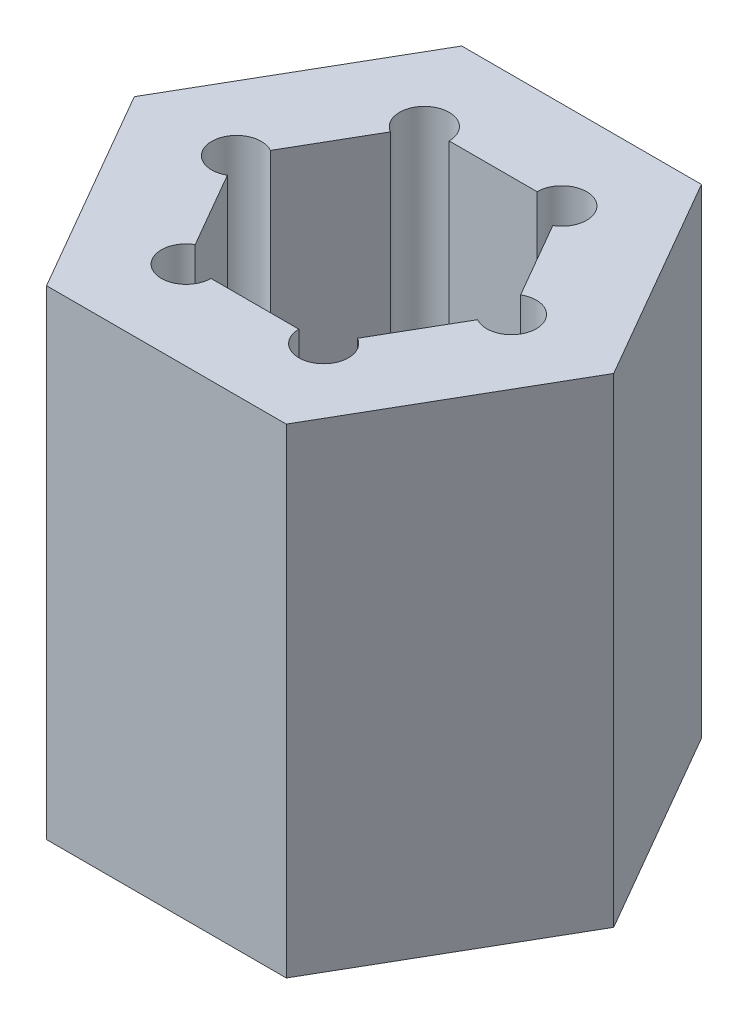
ISO-10303-21;
HEADER;
FILE_DESCRIPTION(('STEP AP214'),'2;1');
FILE_NAME('part.step','',(''),(''),'','','');
FILE_SCHEMA(('AUTOMOTIVE_DESIGN { 1 0 10303 214 1 1 1 1 }'));
ENDSEC;
DATA;
#1=APPLICATION_CONTEXT('core data for automotive mechanical design processes');
#2=APPLICATION_PROTOCOL_DEFINITION('international standard','automotive_design',2000,#1);
#3=PRODUCT_CONTEXT('',#1,'mechanical');
#4=PRODUCT('Part','Part','',(#3));
#5=PRODUCT_RELATED_PRODUCT_CATEGORY('part','',(#4));
#6=PRODUCT_DEFINITION_FORMATION('','',#4);
#7=PRODUCT_DEFINITION_CONTEXT('part definition',#1,'design');
#8=PRODUCT_DEFINITION('design','',#6,#7);
#9=PRODUCT_DEFINITION_SHAPE('','',#8);
#10=(LENGTH_UNIT() NAMED_UNIT(*) SI_UNIT(.MILLI.,.METRE.));
#11=(NAMED_UNIT(*) PLANE_ANGLE_UNIT() SI_UNIT($,.RADIAN.));
#12=(NAMED_UNIT(*) SI_UNIT($,.STERADIAN.) SOLID_ANGLE_UNIT());
#13=UNCERTAINTY_MEASURE_WITH_UNIT(LENGTH_MEASURE(1.E-05),#10,'distance_accuracy_value','');
#14=(GEOMETRIC_REPRESENTATION_CONTEXT(3) GLOBAL_UNCERTAINTY_ASSIGNED_CONTEXT((#13)) GLOBAL_UNIT_ASSIGNED_CONTEXT((#10,
#11,#12)) REPRESENTATION_CONTEXT('',''));
#15=CARTESIAN_POINT('',(0.,0.,0.));
#16=DIRECTION('',(0.,0.,1.));
#17=DIRECTION('',(1.,0.,0.));
#18=AXIS2_PLACEMENT_3D('',#15,#16,#17);
#19=CARTESIAN_POINT('',(0.,14.5,0.));
#20=DIRECTION('',(0.,1.,0.));
#21=DIRECTION('',(0.,0.,1.));
#22=AXIS2_PLACEMENT_3D('',#19,#20,#21);
#23=PLANE('',#22);
#24=CARTESIAN_POINT('',(-4.15692193816526,14.5,0.));
#25=DIRECTION('',(0.,1.,0.));
#26=DIRECTION('',(0.,0.,1.));
#27=AXIS2_PLACEMENT_3D('',#24,#25,#26);
#28=CIRCLE('',#27,0.75);
#29=CARTESIAN_POINT('',(-3.78192193816526,14.5,-0.649519052838404));
#30=VERTEX_POINT('',#29);
#31=CARTESIAN_POINT('',(-3.78192193816533,14.5,0.649519052838291));
#32=VERTEX_POINT('',#31);
#33=EDGE_CURVE('E357',#30,#32,#28,.T.);
#34=ORIENTED_EDGE('',*,*,#33,.F.);
#35=DIRECTION('',(-0.5,0.,0.866025403784439));
#36=VECTOR('',#35,1.);
#37=CARTESIAN_POINT('',(-2.07846096908265,14.5,-3.6));
#38=LINE('',#37,#36);
#39=CARTESIAN_POINT('',(-2.45346096908265,14.5,-2.95048094716167));
#40=VERTEX_POINT('',#39);
#41=EDGE_CURVE('E218',#40,#30,#38,.T.);
#42=ORIENTED_EDGE('',*,*,#41,.F.);
#43=CARTESIAN_POINT('',(-2.07846096908265,14.5,-3.6));
#44=DIRECTION('',(0.,1.,0.));
#45=DIRECTION('',(0.,0.,1.));
#46=AXIS2_PLACEMENT_3D('',#43,#44,#45);
#47=CIRCLE('',#46,0.75);
#48=CARTESIAN_POINT('',(-1.32846096908265,14.5,-3.6));
#49=VERTEX_POINT('',#48);
#50=EDGE_CURVE('E348',#49,#40,#47,.T.);
#51=ORIENTED_EDGE('',*,*,#50,.F.);
#52=DIRECTION('',(-1.,0.,0.));
#53=VECTOR('',#52,1.);
#54=CARTESIAN_POINT('',(2.07846096908265,14.5,-3.6));
#55=LINE('',#54,#53);
#56=CARTESIAN_POINT('',(1.32846096908266,14.5,-3.6));
#57=VERTEX_POINT('',#56);
#58=EDGE_CURVE('E206',#57,#49,#55,.T.);
#59=ORIENTED_EDGE('',*,*,#58,.F.);
#60=CARTESIAN_POINT('',(2.07846096908266,14.5,-3.6));
#61=DIRECTION('',(0.,1.,0.));
#62=DIRECTION('',(0.,0.,1.));
#63=AXIS2_PLACEMENT_3D('',#60,#61,#62);
#64=CIRCLE('',#63,0.75);
#65=CARTESIAN_POINT('',(2.45346096908266,14.5,-2.95048094716166));
#66=VERTEX_POINT('',#65);
#67=EDGE_CURVE('E68',#66,#57,#64,.T.);
#68=ORIENTED_EDGE('',*,*,#67,.F.);
#69=DIRECTION('',(-0.5,0.,-0.866025403784438));
#70=VECTOR('',#69,1.);
#71=CARTESIAN_POINT('',(4.1569219381653,14.5,0.));
#72=LINE('',#71,#70);
#73=CARTESIAN_POINT('',(3.78192193816531,14.5,-0.649519052838314));
#74=VERTEX_POINT('',#73);
#75=EDGE_CURVE('E200',#74,#66,#72,.T.);
#76=ORIENTED_EDGE('',*,*,#75,.F.);
#77=CARTESIAN_POINT('',(4.15692193816531,14.5,0.));
#78=DIRECTION('',(0.,1.,0.));
#79=DIRECTION('',(0.,0.,1.));
#80=AXIS2_PLACEMENT_3D('',#77,#78,#79);
#81=CIRCLE('',#80,0.749999999999999);
#82=CARTESIAN_POINT('',(3.7819219381653,14.5,0.649519052838341));
#83=VERTEX_POINT('',#82);
#84=EDGE_CURVE('E60',#83,#74,#81,.T.);
#85=ORIENTED_EDGE('',*,*,#84,.F.);
#86=DIRECTION('',(0.499999999999999,0.,-0.866025403784439));
#87=VECTOR('',#86,1.);
#88=CARTESIAN_POINT('',(2.07846096908265,14.5,3.6));
#89=LINE('',#88,#87);
#90=CARTESIAN_POINT('',(2.45346096908269,14.5,2.9504809471616));
#91=VERTEX_POINT('',#90);
#92=EDGE_CURVE('E189',#91,#83,#89,.T.);
#93=ORIENTED_EDGE('',*,*,#92,.F.);
#94=CARTESIAN_POINT('',(2.07846096908266,14.5,3.59999999999991));
#95=DIRECTION('',(0.,1.,0.));
#96=DIRECTION('',(0.,0.,1.));
#97=AXIS2_PLACEMENT_3D('',#94,#95,#96);
#98=CIRCLE('',#97,0.75);
#99=CARTESIAN_POINT('',(1.32846096908266,14.5,3.6));
#100=VERTEX_POINT('',#99);
#101=EDGE_CURVE('E169',#100,#91,#98,.T.);
#102=ORIENTED_EDGE('',*,*,#101,.F.);
#103=DIRECTION('',(1.,0.,0.));
#104=VECTOR('',#103,1.);
#105=CARTESIAN_POINT('',(-2.07846096908265,14.5,3.6));
#106=LINE('',#105,#104);
#107=CARTESIAN_POINT('',(-1.32846096908269,14.5,3.6));
#108=VERTEX_POINT('',#107);
#109=EDGE_CURVE('E226',#108,#100,#106,.T.);
#110=ORIENTED_EDGE('',*,*,#109,.F.);
#111=CARTESIAN_POINT('',(-2.07846096908269,14.5,3.59999999999998));
#112=DIRECTION('',(0.,1.,0.));
#113=DIRECTION('',(0.,0.,1.));
#114=AXIS2_PLACEMENT_3D('',#111,#112,#113);
#115=CIRCLE('',#114,0.75);
#116=CARTESIAN_POINT('',(-2.45346096908267,14.5,2.95048094716164));
#117=VERTEX_POINT('',#116);
#118=EDGE_CURVE('E364',#117,#108,#115,.T.);
#119=ORIENTED_EDGE('',*,*,#118,.F.);
#120=DIRECTION('',(0.5,0.,0.866025403784438));
#121=VECTOR('',#120,1.);
#122=CARTESIAN_POINT('',(-4.1569219381653,14.5,0.));
#123=LINE('',#122,#121);
#124=EDGE_CURVE('E222',#32,#117,#123,.T.);
#125=ORIENTED_EDGE('',*,*,#124,.F.);
#126=EDGE_LOOP('',(#34,#42,#51,#59,#68,#76,#85,#93,#102,#110,#119,#125));
#127=FACE_BOUND('',#126,.T.);
#128=DIRECTION('',(-1.,0.,0.));
#129=VECTOR('',#128,1.);
#130=CARTESIAN_POINT('',(3.6228729391649,14.5,-6.275));
#131=LINE('',#130,#129);
#132=CARTESIAN_POINT('',(3.6228729391649,14.5,-6.275));
#133=VERTEX_POINT('',#132);
#134=CARTESIAN_POINT('',(-3.6228729391649,14.5,-6.275));
#135=VERTEX_POINT('',#134);
#136=EDGE_CURVE('E247',#133,#135,#131,.T.);
#137=ORIENTED_EDGE('',*,*,#136,.T.);
#138=DIRECTION('',(-0.5,0.,0.866025403784439));
#139=VECTOR('',#138,1.);
#140=CARTESIAN_POINT('',(-3.6228729391649,14.5,-6.275));
#141=LINE('',#140,#139);
#142=CARTESIAN_POINT('',(-7.2457458783298,14.5,0.));
#143=VERTEX_POINT('',#142);
#144=EDGE_CURVE('E251',#135,#143,#141,.T.);
#145=ORIENTED_EDGE('',*,*,#144,.T.);
#146=DIRECTION('',(0.5,0.,0.866025403784438));
#147=VECTOR('',#146,1.);
#148=CARTESIAN_POINT('',(-7.2457458783298,14.5,0.));
#149=LINE('',#148,#147);
#150=CARTESIAN_POINT('',(-3.6228729391649,14.5,6.275));
#151=VERTEX_POINT('',#150);
#152=EDGE_CURVE('E255',#143,#151,#149,.T.);
#153=ORIENTED_EDGE('',*,*,#152,.T.);
#154=DIRECTION('',(1.,0.,0.));
#155=VECTOR('',#154,1.);
#156=CARTESIAN_POINT('',(-3.6228729391649,14.5,6.275));
#157=LINE('',#156,#155);
#158=CARTESIAN_POINT('',(3.6228729391649,14.5,6.275));
#159=VERTEX_POINT('',#158);
#160=EDGE_CURVE('E258',#151,#159,#157,.T.);
#161=ORIENTED_EDGE('',*,*,#160,.T.);
#162=DIRECTION('',(0.5,0.,-0.866025403784439));
#163=VECTOR('',#162,1.);
#164=CARTESIAN_POINT('',(3.6228729391649,14.5,6.275));
#165=LINE('',#164,#163);
#166=CARTESIAN_POINT('',(7.24574587832981,14.5,0.));
#167=VERTEX_POINT('',#166);
#168=EDGE_CURVE('E261',#159,#167,#165,.T.);
#169=ORIENTED_EDGE('',*,*,#168,.T.);
#170=DIRECTION('',(-0.5,0.,-0.866025403784438));
#171=VECTOR('',#170,1.);
#172=CARTESIAN_POINT('',(7.24574587832981,14.5,0.));
#173=LINE('',#172,#171);
#174=EDGE_CURVE('E264',#167,#133,#173,.T.);
#175=ORIENTED_EDGE('',*,*,#174,.T.);
#176=EDGE_LOOP('',(#137,#145,#153,#161,#169,#175));
#177=FACE_BOUND('',#176,.T.);
#178=ADVANCED_FACE('F45',(#127,#177),#23,.T.);
#179=CARTESIAN_POINT('',(0.,0.,0.));
#180=DIRECTION('',(0.,1.,0.));
#181=DIRECTION('',(0.,0.,1.));
#182=AXIS2_PLACEMENT_3D('',#179,#180,#181);
#183=PLANE('',#182);
#184=DIRECTION('',(-1.,0.,0.));
#185=VECTOR('',#184,1.);
#186=CARTESIAN_POINT('',(3.6228729391649,0.,-6.275));
#187=LINE('',#186,#185);
#188=CARTESIAN_POINT('',(3.6228729391649,0.,-6.275));
#189=VERTEX_POINT('',#188);
#190=CARTESIAN_POINT('',(-3.6228729391649,0.,-6.275));
#191=VERTEX_POINT('',#190);
#192=EDGE_CURVE('E229',#189,#191,#187,.T.);
#193=ORIENTED_EDGE('',*,*,#192,.F.);
#194=DIRECTION('',(-0.5,0.,-0.866025403784438));
#195=VECTOR('',#194,1.);
#196=CARTESIAN_POINT('',(7.24574587832981,0.,0.));
#197=LINE('',#196,#195);
#198=CARTESIAN_POINT('',(7.24574587832981,0.,0.));
#199=VERTEX_POINT('',#198);
#200=EDGE_CURVE('E252',#199,#189,#197,.T.);
#201=ORIENTED_EDGE('',*,*,#200,.F.);
#202=DIRECTION('',(0.5,0.,-0.866025403784439));
#203=VECTOR('',#202,1.);
#204=CARTESIAN_POINT('',(3.6228729391649,0.,6.275));
#205=LINE('',#204,#203);
#206=CARTESIAN_POINT('',(3.6228729391649,0.,6.275));
#207=VERTEX_POINT('',#206);
#208=EDGE_CURVE('E280',#207,#199,#205,.T.);
#209=ORIENTED_EDGE('',*,*,#208,.F.);
#210=DIRECTION('',(1.,0.,0.));
#211=VECTOR('',#210,1.);
#212=CARTESIAN_POINT('',(-3.6228729391649,0.,6.275));
#213=LINE('',#212,#211);
#214=CARTESIAN_POINT('',(-3.6228729391649,0.,6.275));
#215=VERTEX_POINT('',#214);
#216=EDGE_CURVE('E277',#215,#207,#213,.T.);
#217=ORIENTED_EDGE('',*,*,#216,.F.);
#218=DIRECTION('',(0.5,0.,0.866025403784438));
#219=VECTOR('',#218,1.);
#220=CARTESIAN_POINT('',(-7.2457458783298,0.,0.));
#221=LINE('',#220,#219);
#222=CARTESIAN_POINT('',(-7.2457458783298,0.,0.));
#223=VERTEX_POINT('',#222);
#224=EDGE_CURVE('E274',#223,#215,#221,.T.);
#225=ORIENTED_EDGE('',*,*,#224,.F.);
#226=DIRECTION('',(-0.5,0.,0.866025403784439));
#227=VECTOR('',#226,1.);
#228=CARTESIAN_POINT('',(-3.6228729391649,0.,-6.275));
#229=LINE('',#228,#227);
#230=EDGE_CURVE('E271',#191,#223,#229,.T.);
#231=ORIENTED_EDGE('',*,*,#230,.F.);
#232=EDGE_LOOP('',(#193,#201,#209,#217,#225,#231));
#233=FACE_BOUND('',#232,.T.);
#234=DIRECTION('',(-0.5,0.,0.866025403784439));
#235=VECTOR('',#234,1.);
#236=CARTESIAN_POINT('',(-2.07846096908265,0.,-3.6));
#237=LINE('',#236,#235);
#238=CARTESIAN_POINT('',(-2.45346096908265,0.,-2.95048094716167));
#239=VERTEX_POINT('',#238);
#240=CARTESIAN_POINT('',(-3.78192193816526,0.,-0.649519052838404));
#241=VERTEX_POINT('',#240);
#242=EDGE_CURVE('E240',#239,#241,#237,.T.);
#243=ORIENTED_EDGE('',*,*,#242,.T.);
#244=CARTESIAN_POINT('',(-4.15692193816526,0.,0.));
#245=DIRECTION('',(0.,1.,0.));
#246=DIRECTION('',(0.,0.,1.));
#247=AXIS2_PLACEMENT_3D('',#244,#245,#246);
#248=CIRCLE('',#247,0.75);
#249=CARTESIAN_POINT('',(-3.78192193816533,0.,0.649519052838291));
#250=VERTEX_POINT('',#249);
#251=EDGE_CURVE('E353',#241,#250,#248,.T.);
#252=ORIENTED_EDGE('',*,*,#251,.T.);
#253=DIRECTION('',(0.5,0.,0.866025403784438));
#254=VECTOR('',#253,1.);
#255=CARTESIAN_POINT('',(-4.1569219381653,0.,0.));
#256=LINE('',#255,#254);
#257=CARTESIAN_POINT('',(-2.45346096908267,0.,2.95048094716164));
#258=VERTEX_POINT('',#257);
#259=EDGE_CURVE('E209',#250,#258,#256,.T.);
#260=ORIENTED_EDGE('',*,*,#259,.T.);
#261=CARTESIAN_POINT('',(-2.07846096908269,0.,3.59999999999998));
#262=DIRECTION('',(0.,1.,0.));
#263=DIRECTION('',(0.,0.,1.));
#264=AXIS2_PLACEMENT_3D('',#261,#262,#263);
#265=CIRCLE('',#264,0.75);
#266=CARTESIAN_POINT('',(-1.32846096908269,0.,3.6));
#267=VERTEX_POINT('',#266);
#268=EDGE_CURVE('E360',#258,#267,#265,.T.);
#269=ORIENTED_EDGE('',*,*,#268,.T.);
#270=DIRECTION('',(1.,0.,0.));
#271=VECTOR('',#270,1.);
#272=CARTESIAN_POINT('',(-2.07846096908265,0.,3.6));
#273=LINE('',#272,#271);
#274=CARTESIAN_POINT('',(1.32846096908266,0.,3.6));
#275=VERTEX_POINT('',#274);
#276=EDGE_CURVE('E201',#267,#275,#273,.T.);
#277=ORIENTED_EDGE('',*,*,#276,.T.);
#278=CARTESIAN_POINT('',(2.07846096908266,0.,3.59999999999991));
#279=DIRECTION('',(0.,1.,0.));
#280=DIRECTION('',(0.,0.,1.));
#281=AXIS2_PLACEMENT_3D('',#278,#279,#280);
#282=CIRCLE('',#281,0.75);
#283=CARTESIAN_POINT('',(2.45346096908269,0.,2.9504809471616));
#284=VERTEX_POINT('',#283);
#285=EDGE_CURVE('E182',#275,#284,#282,.T.);
#286=ORIENTED_EDGE('',*,*,#285,.T.);
#287=DIRECTION('',(0.499999999999999,0.,-0.866025403784439));
#288=VECTOR('',#287,1.);
#289=CARTESIAN_POINT('',(2.07846096908265,0.,3.6));
#290=LINE('',#289,#288);
#291=CARTESIAN_POINT('',(3.7819219381653,0.,0.649519052838341));
#292=VERTEX_POINT('',#291);
#293=EDGE_CURVE('E191',#284,#292,#290,.T.);
#294=ORIENTED_EDGE('',*,*,#293,.T.);
#295=CARTESIAN_POINT('',(4.15692193816531,0.,0.));
#296=DIRECTION('',(0.,1.,0.));
#297=DIRECTION('',(0.,0.,1.));
#298=AXIS2_PLACEMENT_3D('',#295,#296,#297);
#299=CIRCLE('',#298,0.749999999999999);
#300=CARTESIAN_POINT('',(3.78192193816531,0.,-0.649519052838314));
#301=VERTEX_POINT('',#300);
#302=EDGE_CURVE('E181',#292,#301,#299,.T.);
#303=ORIENTED_EDGE('',*,*,#302,.T.);
#304=DIRECTION('',(-0.5,0.,-0.866025403784438));
#305=VECTOR('',#304,1.);
#306=CARTESIAN_POINT('',(4.1569219381653,0.,0.));
#307=LINE('',#306,#305);
#308=CARTESIAN_POINT('',(2.45346096908266,0.,-2.95048094716166));
#309=VERTEX_POINT('',#308);
#310=EDGE_CURVE('E232',#301,#309,#307,.T.);
#311=ORIENTED_EDGE('',*,*,#310,.T.);
#312=CARTESIAN_POINT('',(2.07846096908266,0.,-3.6));
#313=DIRECTION('',(0.,1.,0.));
#314=DIRECTION('',(0.,0.,1.));
#315=AXIS2_PLACEMENT_3D('',#312,#313,#314);
#316=CIRCLE('',#315,0.75);
#317=CARTESIAN_POINT('',(1.32846096908266,0.,-3.6));
#318=VERTEX_POINT('',#317);
#319=EDGE_CURVE('E321',#309,#318,#316,.T.);
#320=ORIENTED_EDGE('',*,*,#319,.T.);
#321=DIRECTION('',(-1.,0.,0.));
#322=VECTOR('',#321,1.);
#323=CARTESIAN_POINT('',(2.07846096908265,0.,-3.6));
#324=LINE('',#323,#322);
#325=CARTESIAN_POINT('',(-1.32846096908265,0.,-3.6));
#326=VERTEX_POINT('',#325);
#327=EDGE_CURVE('E236',#318,#326,#324,.T.);
#328=ORIENTED_EDGE('',*,*,#327,.T.);
#329=CARTESIAN_POINT('',(-2.07846096908265,0.,-3.6));
#330=DIRECTION('',(0.,1.,0.));
#331=DIRECTION('',(0.,0.,1.));
#332=AXIS2_PLACEMENT_3D('',#329,#330,#331);
#333=CIRCLE('',#332,0.75);
#334=EDGE_CURVE('E194',#326,#239,#333,.T.);
#335=ORIENTED_EDGE('',*,*,#334,.T.);
#336=EDGE_LOOP('',(#243,#252,#260,#269,#277,#286,#294,#303,#311,#320,#328,#335));
#337=FACE_BOUND('',#336,.T.);
#338=ADVANCED_FACE('F327',(#233,#337),#183,.F.);
#339=CARTESIAN_POINT('',(3.6228729391649,14.5,-6.275));
#340=DIRECTION('',(0.,0.,1.));
#341=DIRECTION('',(1.,0.,0.));
#342=AXIS2_PLACEMENT_3D('',#339,#340,#341);
#343=PLANE('',#342);
#344=ORIENTED_EDGE('',*,*,#192,.T.);
#345=DIRECTION('',(0.,-1.,0.));
#346=VECTOR('',#345,1.);
#347=CARTESIAN_POINT('',(-3.6228729391649,14.5,-6.275));
#348=LINE('',#347,#346);
#349=EDGE_CURVE('E304',#135,#191,#348,.T.);
#350=ORIENTED_EDGE('',*,*,#349,.F.);
#351=ORIENTED_EDGE('',*,*,#136,.F.);
#352=DIRECTION('',(0.,-1.,0.));
#353=VECTOR('',#352,1.);
#354=CARTESIAN_POINT('',(3.6228729391649,14.5,-6.275));
#355=LINE('',#354,#353);
#356=EDGE_CURVE('E267',#133,#189,#355,.T.);
#357=ORIENTED_EDGE('',*,*,#356,.T.);
#358=EDGE_LOOP('',(#344,#350,#351,#357));
#359=FACE_BOUND('',#358,.T.);
#360=ADVANCED_FACE('F47',(#359),#343,.F.);
#361=CARTESIAN_POINT('',(-3.6228729391649,14.5,-6.275));
#362=DIRECTION('',(0.866025403784439,0.,0.5));
#363=DIRECTION('',(0.5,0.,-0.866025403784439));
#364=AXIS2_PLACEMENT_3D('',#361,#362,#363);
#365=PLANE('',#364);
#366=ORIENTED_EDGE('',*,*,#230,.T.);
#367=DIRECTION('',(0.,-1.,0.));
#368=VECTOR('',#367,1.);
#369=CARTESIAN_POINT('',(-7.2457458783298,14.5,0.));
#370=LINE('',#369,#368);
#371=EDGE_CURVE('E300',#143,#223,#370,.T.);
#372=ORIENTED_EDGE('',*,*,#371,.F.);
#373=ORIENTED_EDGE('',*,*,#144,.F.);
#374=ORIENTED_EDGE('',*,*,#349,.T.);
#375=EDGE_LOOP('',(#366,#372,#373,#374));
#376=FACE_BOUND('',#375,.T.);
#377=ADVANCED_FACE('F430',(#376),#365,.F.);
#378=CARTESIAN_POINT('',(-7.2457458783298,14.5,0.));
#379=DIRECTION('',(0.866025403784439,0.,-0.5));
#380=DIRECTION('',(-0.5,0.,-0.866025403784439));
#381=AXIS2_PLACEMENT_3D('',#378,#379,#380);
#382=PLANE('',#381);
#383=ORIENTED_EDGE('',*,*,#224,.T.);
#384=DIRECTION('',(0.,-1.,0.));
#385=VECTOR('',#384,1.);
#386=CARTESIAN_POINT('',(-3.6228729391649,14.5,6.275));
#387=LINE('',#386,#385);
#388=EDGE_CURVE('E296',#151,#215,#387,.T.);
#389=ORIENTED_EDGE('',*,*,#388,.F.);
#390=ORIENTED_EDGE('',*,*,#152,.F.);
#391=ORIENTED_EDGE('',*,*,#371,.T.);
#392=EDGE_LOOP('',(#383,#389,#390,#391));
#393=FACE_BOUND('',#392,.T.);
#394=ADVANCED_FACE('F427',(#393),#382,.F.);
#395=CARTESIAN_POINT('',(-3.6228729391649,14.5,6.275));
#396=DIRECTION('',(0.,0.,-1.));
#397=DIRECTION('',(-1.,0.,0.));
#398=AXIS2_PLACEMENT_3D('',#395,#396,#397);
#399=PLANE('',#398);
#400=ORIENTED_EDGE('',*,*,#216,.T.);
#401=DIRECTION('',(0.,-1.,0.));
#402=VECTOR('',#401,1.);
#403=CARTESIAN_POINT('',(3.6228729391649,14.5,6.275));
#404=LINE('',#403,#402);
#405=EDGE_CURVE('E292',#159,#207,#404,.T.);
#406=ORIENTED_EDGE('',*,*,#405,.F.);
#407=ORIENTED_EDGE('',*,*,#160,.F.);
#408=ORIENTED_EDGE('',*,*,#388,.T.);
#409=EDGE_LOOP('',(#400,#406,#407,#408));
#410=FACE_BOUND('',#409,.T.);
#411=ADVANCED_FACE('F423',(#410),#399,.F.);
#412=CARTESIAN_POINT('',(3.6228729391649,14.5,6.275));
#413=DIRECTION('',(-0.866025403784439,0.,-0.5));
#414=DIRECTION('',(-0.5,0.,0.866025403784439));
#415=AXIS2_PLACEMENT_3D('',#412,#413,#414);
#416=PLANE('',#415);
#417=ORIENTED_EDGE('',*,*,#208,.T.);
#418=DIRECTION('',(0.,-1.,0.));
#419=VECTOR('',#418,1.);
#420=CARTESIAN_POINT('',(7.24574587832981,14.5,0.));
#421=LINE('',#420,#419);
#422=EDGE_CURVE('E288',#167,#199,#421,.T.);
#423=ORIENTED_EDGE('',*,*,#422,.F.);
#424=ORIENTED_EDGE('',*,*,#168,.F.);
#425=ORIENTED_EDGE('',*,*,#405,.T.);
#426=EDGE_LOOP('',(#417,#423,#424,#425));
#427=FACE_BOUND('',#426,.T.);
#428=ADVANCED_FACE('F419',(#427),#416,.F.);
#429=CARTESIAN_POINT('',(7.24574587832981,14.5,0.));
#430=DIRECTION('',(-0.866025403784439,0.,0.5));
#431=DIRECTION('',(0.5,0.,0.866025403784439));
#432=AXIS2_PLACEMENT_3D('',#429,#430,#431);
#433=PLANE('',#432);
#434=ORIENTED_EDGE('',*,*,#200,.T.);
#435=ORIENTED_EDGE('',*,*,#356,.F.);
#436=ORIENTED_EDGE('',*,*,#174,.F.);
#437=ORIENTED_EDGE('',*,*,#422,.T.);
#438=EDGE_LOOP('',(#434,#435,#436,#437));
#439=FACE_BOUND('',#438,.T.);
#440=ADVANCED_FACE('F417',(#439),#433,.F.);
#441=CARTESIAN_POINT('',(2.07846096908265,14.5,3.6));
#442=DIRECTION('',(-0.866025403784439,0.,-0.5));
#443=DIRECTION('',(-0.5,0.,0.866025403784439));
#444=AXIS2_PLACEMENT_3D('',#441,#442,#443);
#445=PLANE('',#444);
#446=DIRECTION('',(0.,1.,0.));
#447=VECTOR('',#446,1.);
#448=CARTESIAN_POINT('',(2.45346096908269,0.,2.9504809471616));
#449=LINE('',#448,#447);
#450=EDGE_CURVE('E172',#91,#284,#449,.F.);
#451=ORIENTED_EDGE('',*,*,#450,.F.);
#452=ORIENTED_EDGE('',*,*,#92,.T.);
#453=DIRECTION('',(0.,1.,0.));
#454=VECTOR('',#453,1.);
#455=CARTESIAN_POINT('',(3.7819219381653,0.,0.649519052838341));
#456=LINE('',#455,#454);
#457=EDGE_CURVE('E212',#292,#83,#456,.T.);
#458=ORIENTED_EDGE('',*,*,#457,.F.);
#459=ORIENTED_EDGE('',*,*,#293,.F.);
#460=EDGE_LOOP('',(#451,#452,#458,#459));
#461=FACE_BOUND('',#460,.T.);
#462=ADVANCED_FACE('F187',(#461),#445,.T.);
#463=CARTESIAN_POINT('',(4.1569219381653,14.5,0.));
#464=DIRECTION('',(-0.866025403784438,0.,0.5));
#465=DIRECTION('',(0.5,0.,0.866025403784439));
#466=AXIS2_PLACEMENT_3D('',#463,#464,#465);
#467=PLANE('',#466);
#468=DIRECTION('',(0.,1.,0.));
#469=VECTOR('',#468,1.);
#470=CARTESIAN_POINT('',(3.78192193816531,0.,-0.649519052838313));
#471=LINE('',#470,#469);
#472=EDGE_CURVE('E11',#74,#301,#471,.F.);
#473=ORIENTED_EDGE('',*,*,#472,.F.);
#474=ORIENTED_EDGE('',*,*,#75,.T.);
#475=DIRECTION('',(0.,1.,0.));
#476=VECTOR('',#475,1.);
#477=CARTESIAN_POINT('',(2.45346096908266,0.,-2.95048094716166));
#478=LINE('',#477,#476);
#479=EDGE_CURVE('E339',#309,#66,#478,.T.);
#480=ORIENTED_EDGE('',*,*,#479,.F.);
#481=ORIENTED_EDGE('',*,*,#310,.F.);
#482=EDGE_LOOP('',(#473,#474,#480,#481));
#483=FACE_BOUND('',#482,.T.);
#484=ADVANCED_FACE('F375',(#483),#467,.T.);
#485=CARTESIAN_POINT('',(2.07846096908265,14.5,-3.6));
#486=DIRECTION('',(0.,0.,1.));
#487=DIRECTION('',(1.,0.,0.));
#488=AXIS2_PLACEMENT_3D('',#485,#486,#487);
#489=PLANE('',#488);
#490=DIRECTION('',(0.,1.,0.));
#491=VECTOR('',#490,1.);
#492=CARTESIAN_POINT('',(1.32846096908266,0.,-3.6));
#493=LINE('',#492,#491);
#494=EDGE_CURVE('E54',#57,#318,#493,.F.);
#495=ORIENTED_EDGE('',*,*,#494,.F.);
#496=ORIENTED_EDGE('',*,*,#58,.T.);
#497=DIRECTION('',(0.,1.,0.));
#498=VECTOR('',#497,1.);
#499=CARTESIAN_POINT('',(-1.32846096908265,0.,-3.6));
#500=LINE('',#499,#498);
#501=EDGE_CURVE('E335',#326,#49,#500,.T.);
#502=ORIENTED_EDGE('',*,*,#501,.F.);
#503=ORIENTED_EDGE('',*,*,#327,.F.);
#504=EDGE_LOOP('',(#495,#496,#502,#503));
#505=FACE_BOUND('',#504,.T.);
#506=ADVANCED_FACE('F334',(#505),#489,.T.);
#507=CARTESIAN_POINT('',(-2.07846096908265,14.5,-3.6));
#508=DIRECTION('',(0.866025403784439,0.,0.5));
#509=DIRECTION('',(0.5,0.,-0.866025403784439));
#510=AXIS2_PLACEMENT_3D('',#507,#508,#509);
#511=PLANE('',#510);
#512=DIRECTION('',(0.,1.,0.));
#513=VECTOR('',#512,1.);
#514=CARTESIAN_POINT('',(-3.78192193816526,0.,-0.649519052838404));
#515=LINE('',#514,#513);
#516=EDGE_CURVE('E340',#241,#30,#515,.T.);
#517=ORIENTED_EDGE('',*,*,#516,.F.);
#518=ORIENTED_EDGE('',*,*,#242,.F.);
#519=DIRECTION('',(0.,1.,0.));
#520=VECTOR('',#519,1.);
#521=CARTESIAN_POINT('',(-2.45346096908265,0.,-2.95048094716167));
#522=LINE('',#521,#520);
#523=EDGE_CURVE('E316',#40,#239,#522,.F.);
#524=ORIENTED_EDGE('',*,*,#523,.F.);
#525=ORIENTED_EDGE('',*,*,#41,.T.);
#526=EDGE_LOOP('',(#517,#518,#524,#525));
#527=FACE_BOUND('',#526,.T.);
#528=ADVANCED_FACE('F382',(#527),#511,.T.);
#529=CARTESIAN_POINT('',(-4.1569219381653,14.5,0.));
#530=DIRECTION('',(0.866025403784439,0.,-0.5));
#531=DIRECTION('',(-0.5,0.,-0.866025403784439));
#532=AXIS2_PLACEMENT_3D('',#529,#530,#531);
#533=PLANE('',#532);
#534=DIRECTION('',(0.,1.,0.));
#535=VECTOR('',#534,1.);
#536=CARTESIAN_POINT('',(-3.78192193816533,0.,0.649519052838291));
#537=LINE('',#536,#535);
#538=EDGE_CURVE('E313',#32,#250,#537,.F.);
#539=ORIENTED_EDGE('',*,*,#538,.F.);
#540=ORIENTED_EDGE('',*,*,#124,.T.);
#541=DIRECTION('',(0.,1.,0.));
#542=VECTOR('',#541,1.);
#543=CARTESIAN_POINT('',(-2.45346096908267,0.,2.95048094716164));
#544=LINE('',#543,#542);
#545=EDGE_CURVE('E193',#258,#117,#544,.T.);
#546=ORIENTED_EDGE('',*,*,#545,.F.);
#547=ORIENTED_EDGE('',*,*,#259,.F.);
#548=EDGE_LOOP('',(#539,#540,#546,#547));
#549=FACE_BOUND('',#548,.T.);
#550=ADVANCED_FACE('F388',(#549),#533,.T.);
#551=CARTESIAN_POINT('',(-2.07846096908265,14.5,3.6));
#552=DIRECTION('',(0.,0.,-1.));
#553=DIRECTION('',(-1.,0.,0.));
#554=AXIS2_PLACEMENT_3D('',#551,#552,#553);
#555=PLANE('',#554);
#556=DIRECTION('',(0.,1.,0.));
#557=VECTOR('',#556,1.);
#558=CARTESIAN_POINT('',(-1.32846096908269,0.,3.6));
#559=LINE('',#558,#557);
#560=EDGE_CURVE('E310',#108,#267,#559,.F.);
#561=ORIENTED_EDGE('',*,*,#560,.F.);
#562=ORIENTED_EDGE('',*,*,#109,.T.);
#563=DIRECTION('',(0.,1.,0.));
#564=VECTOR('',#563,1.);
#565=CARTESIAN_POINT('',(1.32846096908266,0.,3.6));
#566=LINE('',#565,#564);
#567=EDGE_CURVE('E175',#275,#100,#566,.T.);
#568=ORIENTED_EDGE('',*,*,#567,.F.);
#569=ORIENTED_EDGE('',*,*,#276,.F.);
#570=EDGE_LOOP('',(#561,#562,#568,#569));
#571=FACE_BOUND('',#570,.T.);
#572=ADVANCED_FACE('F395',(#571),#555,.T.);
#573=CARTESIAN_POINT('',(2.07846096908266,0.,3.59999999999991));
#574=DIRECTION('',(0.,1.,0.));
#575=DIRECTION('',(0.,0.,1.));
#576=AXIS2_PLACEMENT_3D('',#573,#574,#575);
#577=CYLINDRICAL_SURFACE('',#576,0.75);
#578=ORIENTED_EDGE('',*,*,#450,.T.);
#579=ORIENTED_EDGE('',*,*,#285,.F.);
#580=ORIENTED_EDGE('',*,*,#567,.T.);
#581=ORIENTED_EDGE('',*,*,#101,.T.);
#582=EDGE_LOOP('',(#578,#579,#580,#581));
#583=FACE_BOUND('',#582,.T.);
#584=ADVANCED_FACE('F171',(#583),#577,.F.);
#585=CARTESIAN_POINT('',(-2.07846096908269,0.,3.59999999999998));
#586=DIRECTION('',(0.,1.,0.));
#587=DIRECTION('',(0.,0.,1.));
#588=AXIS2_PLACEMENT_3D('',#585,#586,#587);
#589=CYLINDRICAL_SURFACE('',#588,0.75);
#590=ORIENTED_EDGE('',*,*,#545,.T.);
#591=ORIENTED_EDGE('',*,*,#118,.T.);
#592=ORIENTED_EDGE('',*,*,#560,.T.);
#593=ORIENTED_EDGE('',*,*,#268,.F.);
#594=EDGE_LOOP('',(#590,#591,#592,#593));
#595=FACE_BOUND('',#594,.T.);
#596=ADVANCED_FACE('F392',(#595),#589,.F.);
#597=CARTESIAN_POINT('',(-4.15692193816526,0.,0.));
#598=DIRECTION('',(0.,1.,0.));
#599=DIRECTION('',(0.,0.,1.));
#600=AXIS2_PLACEMENT_3D('',#597,#598,#599);
#601=CYLINDRICAL_SURFACE('',#600,0.75);
#602=ORIENTED_EDGE('',*,*,#516,.T.);
#603=ORIENTED_EDGE('',*,*,#33,.T.);
#604=ORIENTED_EDGE('',*,*,#538,.T.);
#605=ORIENTED_EDGE('',*,*,#251,.F.);
#606=EDGE_LOOP('',(#602,#603,#604,#605));
#607=FACE_BOUND('',#606,.T.);
#608=ADVANCED_FACE('F544',(#607),#601,.F.);
#609=CARTESIAN_POINT('',(-2.07846096908265,0.,-3.6));
#610=DIRECTION('',(0.,1.,0.));
#611=DIRECTION('',(0.,0.,1.));
#612=AXIS2_PLACEMENT_3D('',#609,#610,#611);
#613=CYLINDRICAL_SURFACE('',#612,0.75);
#614=ORIENTED_EDGE('',*,*,#501,.T.);
#615=ORIENTED_EDGE('',*,*,#50,.T.);
#616=ORIENTED_EDGE('',*,*,#523,.T.);
#617=ORIENTED_EDGE('',*,*,#334,.F.);
#618=EDGE_LOOP('',(#614,#615,#616,#617));
#619=FACE_BOUND('',#618,.T.);
#620=ADVANCED_FACE('F378',(#619),#613,.F.);
#621=CARTESIAN_POINT('',(2.07846096908266,0.,-3.6));
#622=DIRECTION('',(0.,1.,0.));
#623=DIRECTION('',(0.,0.,1.));
#624=AXIS2_PLACEMENT_3D('',#621,#622,#623);
#625=CYLINDRICAL_SURFACE('',#624,0.75);
#626=ORIENTED_EDGE('',*,*,#479,.T.);
#627=ORIENTED_EDGE('',*,*,#67,.T.);
#628=ORIENTED_EDGE('',*,*,#494,.T.);
#629=ORIENTED_EDGE('',*,*,#319,.F.);
#630=EDGE_LOOP('',(#626,#627,#628,#629));
#631=FACE_BOUND('',#630,.T.);
#632=ADVANCED_FACE('F320',(#631),#625,.F.);
#633=CARTESIAN_POINT('',(4.15692193816531,0.,0.));
#634=DIRECTION('',(0.,1.,0.));
#635=DIRECTION('',(0.,0.,1.));
#636=AXIS2_PLACEMENT_3D('',#633,#634,#635);
#637=CYLINDRICAL_SURFACE('',#636,0.749999999999999);
#638=ORIENTED_EDGE('',*,*,#457,.T.);
#639=ORIENTED_EDGE('',*,*,#84,.T.);
#640=ORIENTED_EDGE('',*,*,#472,.T.);
#641=ORIENTED_EDGE('',*,*,#302,.F.);
#642=EDGE_LOOP('',(#638,#639,#640,#641));
#643=FACE_BOUND('',#642,.T.);
#644=ADVANCED_FACE('F568',(#643),#637,.F.);
#645=CLOSED_SHELL('',(#178,#338,#360,#377,#394,#411,#428,#440,#462,#484,#506,#528,#550,#572,
#584,#596,#608,#620,#632,#644));
#646=MANIFOLD_SOLID_BREP('B2',#645);
#647=ADVANCED_BREP_SHAPE_REPRESENTATION('',(#18,#646),#14);
#648=SHAPE_DEFINITION_REPRESENTATION(#9,#647);
ENDSEC;
END-ISO-10303-21;
